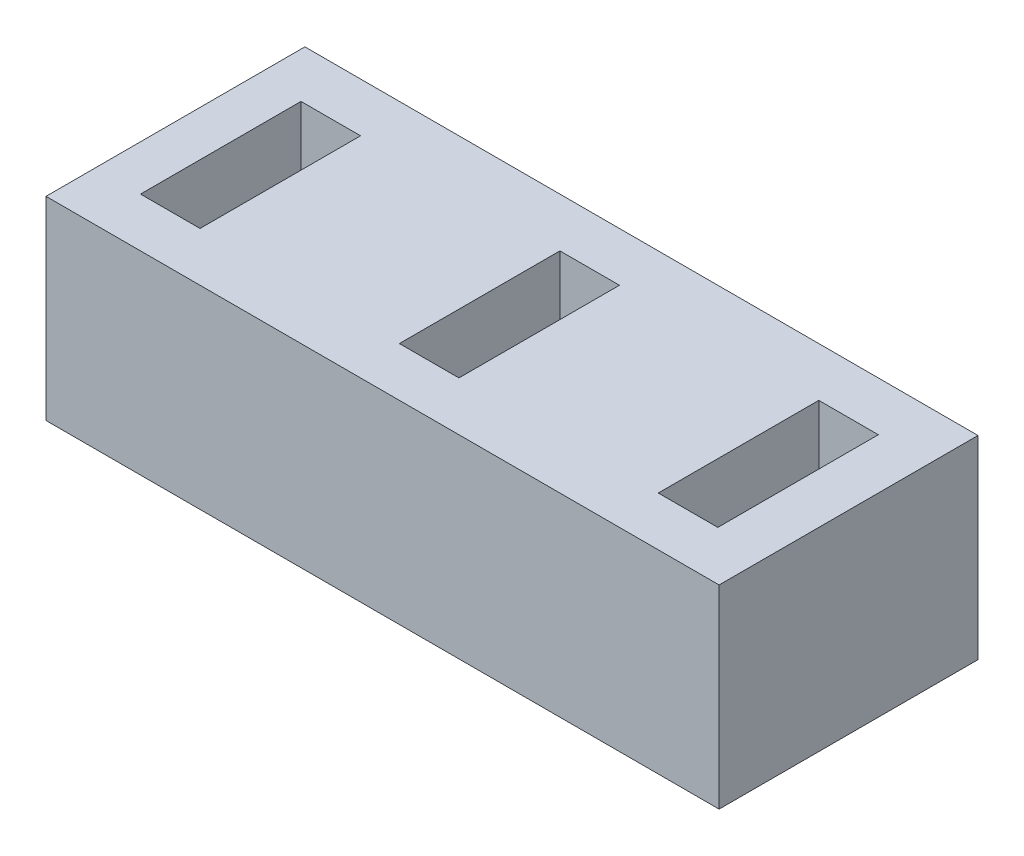
ISO-10303-21;
HEADER;
FILE_DESCRIPTION(('STEP AP214'),'2;1');
FILE_NAME('part.step','',(''),(''),'','','');
FILE_SCHEMA(('AUTOMOTIVE_DESIGN { 1 0 10303 214 1 1 1 1 }'));
ENDSEC;
DATA;
#1=APPLICATION_CONTEXT('core data for automotive mechanical design processes');
#2=APPLICATION_PROTOCOL_DEFINITION('international standard','automotive_design',2000,#1);
#3=PRODUCT_CONTEXT('',#1,'mechanical');
#4=PRODUCT('Part','Part','',(#3));
#5=PRODUCT_RELATED_PRODUCT_CATEGORY('part','',(#4));
#6=PRODUCT_DEFINITION_FORMATION('','',#4);
#7=PRODUCT_DEFINITION_CONTEXT('part definition',#1,'design');
#8=PRODUCT_DEFINITION('design','',#6,#7);
#9=PRODUCT_DEFINITION_SHAPE('','',#8);
#10=(LENGTH_UNIT() NAMED_UNIT(*) SI_UNIT(.MILLI.,.METRE.));
#11=(NAMED_UNIT(*) PLANE_ANGLE_UNIT() SI_UNIT($,.RADIAN.));
#12=(NAMED_UNIT(*) SI_UNIT($,.STERADIAN.) SOLID_ANGLE_UNIT());
#13=UNCERTAINTY_MEASURE_WITH_UNIT(LENGTH_MEASURE(1.E-05),#10,'distance_accuracy_value','');
#14=(GEOMETRIC_REPRESENTATION_CONTEXT(3) GLOBAL_UNCERTAINTY_ASSIGNED_CONTEXT((#13)) GLOBAL_UNIT_ASSIGNED_CONTEXT((#10,
#11,#12)) REPRESENTATION_CONTEXT('',''));
#15=CARTESIAN_POINT('',(0.,0.,0.));
#16=DIRECTION('',(0.,0.,1.));
#17=DIRECTION('',(1.,0.,0.));
#18=AXIS2_PLACEMENT_3D('',#15,#16,#17);
#19=CARTESIAN_POINT('',(52.,15.,-20.));
#20=DIRECTION('',(1.,0.,0.));
#21=DIRECTION('',(0.,0.,-1.));
#22=AXIS2_PLACEMENT_3D('',#19,#20,#21);
#23=PLANE('',#22);
#24=DIRECTION('',(0.,0.,1.));
#25=VECTOR('',#24,1.);
#26=CARTESIAN_POINT('',(52.,0.,-20.));
#27=LINE('',#26,#25);
#28=CARTESIAN_POINT('',(52.,0.,-20.));
#29=VERTEX_POINT('',#28);
#30=CARTESIAN_POINT('',(52.,0.,0.));
#31=VERTEX_POINT('',#30);
#32=EDGE_CURVE('E203',#29,#31,#27,.T.);
#33=ORIENTED_EDGE('',*,*,#32,.F.);
#34=DIRECTION('',(0.,-1.,0.));
#35=VECTOR('',#34,1.);
#36=CARTESIAN_POINT('',(52.,15.,-20.));
#37=LINE('',#36,#35);
#38=CARTESIAN_POINT('',(52.,15.,-20.));
#39=VERTEX_POINT('',#38);
#40=EDGE_CURVE('E11',#39,#29,#37,.T.);
#41=ORIENTED_EDGE('',*,*,#40,.F.);
#42=DIRECTION('',(0.,0.,1.));
#43=VECTOR('',#42,1.);
#44=CARTESIAN_POINT('',(52.,15.,-20.));
#45=LINE('',#44,#43);
#46=CARTESIAN_POINT('',(52.,15.,0.));
#47=VERTEX_POINT('',#46);
#48=EDGE_CURVE('E295',#39,#47,#45,.T.);
#49=ORIENTED_EDGE('',*,*,#48,.T.);
#50=DIRECTION('',(0.,-1.,0.));
#51=VECTOR('',#50,1.);
#52=CARTESIAN_POINT('',(52.,15.,0.));
#53=LINE('',#52,#51);
#54=EDGE_CURVE('E46',#47,#31,#53,.T.);
#55=ORIENTED_EDGE('',*,*,#54,.T.);
#56=EDGE_LOOP('',(#33,#41,#49,#55));
#57=FACE_BOUND('',#56,.T.);
#58=ADVANCED_FACE('F43',(#57),#23,.T.);
#59=CARTESIAN_POINT('',(0.,15.,-20.));
#60=DIRECTION('',(0.,0.,-1.));
#61=DIRECTION('',(-1.,0.,0.));
#62=AXIS2_PLACEMENT_3D('',#59,#60,#61);
#63=PLANE('',#62);
#64=DIRECTION('',(1.,0.,0.));
#65=VECTOR('',#64,1.);
#66=CARTESIAN_POINT('',(0.,0.,-20.));
#67=LINE('',#66,#65);
#68=CARTESIAN_POINT('',(0.,0.,-20.));
#69=VERTEX_POINT('',#68);
#70=EDGE_CURVE('E300',#69,#29,#67,.T.);
#71=ORIENTED_EDGE('',*,*,#70,.F.);
#72=DIRECTION('',(0.,-1.,0.));
#73=VECTOR('',#72,1.);
#74=CARTESIAN_POINT('',(0.,15.,-20.));
#75=LINE('',#74,#73);
#76=CARTESIAN_POINT('',(0.,15.,-20.));
#77=VERTEX_POINT('',#76);
#78=EDGE_CURVE('E52',#77,#69,#75,.T.);
#79=ORIENTED_EDGE('',*,*,#78,.F.);
#80=DIRECTION('',(1.,0.,0.));
#81=VECTOR('',#80,1.);
#82=CARTESIAN_POINT('',(0.,15.,-20.));
#83=LINE('',#82,#81);
#84=EDGE_CURVE('E308',#77,#39,#83,.T.);
#85=ORIENTED_EDGE('',*,*,#84,.T.);
#86=ORIENTED_EDGE('',*,*,#40,.T.);
#87=EDGE_LOOP('',(#71,#79,#85,#86));
#88=FACE_BOUND('',#87,.T.);
#89=ADVANCED_FACE('F341',(#88),#63,.T.);
#90=CARTESIAN_POINT('',(0.,15.,0.));
#91=DIRECTION('',(-1.,0.,0.));
#92=DIRECTION('',(0.,0.,1.));
#93=AXIS2_PLACEMENT_3D('',#90,#91,#92);
#94=PLANE('',#93);
#95=DIRECTION('',(0.,0.,-1.));
#96=VECTOR('',#95,1.);
#97=CARTESIAN_POINT('',(0.,0.,0.));
#98=LINE('',#97,#96);
#99=CARTESIAN_POINT('',(0.,0.,0.));
#100=VERTEX_POINT('',#99);
#101=EDGE_CURVE('E319',#100,#69,#98,.T.);
#102=ORIENTED_EDGE('',*,*,#101,.F.);
#103=DIRECTION('',(0.,-1.,0.));
#104=VECTOR('',#103,1.);
#105=CARTESIAN_POINT('',(0.,15.,0.));
#106=LINE('',#105,#104);
#107=CARTESIAN_POINT('',(0.,15.,0.));
#108=VERTEX_POINT('',#107);
#109=EDGE_CURVE('E327',#108,#100,#106,.T.);
#110=ORIENTED_EDGE('',*,*,#109,.F.);
#111=DIRECTION('',(0.,0.,-1.));
#112=VECTOR('',#111,1.);
#113=CARTESIAN_POINT('',(0.,15.,0.));
#114=LINE('',#113,#112);
#115=EDGE_CURVE('E304',#108,#77,#114,.T.);
#116=ORIENTED_EDGE('',*,*,#115,.T.);
#117=ORIENTED_EDGE('',*,*,#78,.T.);
#118=EDGE_LOOP('',(#102,#110,#116,#117));
#119=FACE_BOUND('',#118,.T.);
#120=ADVANCED_FACE('F347',(#119),#94,.T.);
#121=CARTESIAN_POINT('',(52.,15.,0.));
#122=DIRECTION('',(0.,0.,1.));
#123=DIRECTION('',(1.,0.,0.));
#124=AXIS2_PLACEMENT_3D('',#121,#122,#123);
#125=PLANE('',#124);
#126=DIRECTION('',(-1.,0.,0.));
#127=VECTOR('',#126,1.);
#128=CARTESIAN_POINT('',(52.,0.,0.));
#129=LINE('',#128,#127);
#130=EDGE_CURVE('E315',#31,#100,#129,.T.);
#131=ORIENTED_EDGE('',*,*,#130,.F.);
#132=ORIENTED_EDGE('',*,*,#54,.F.);
#133=DIRECTION('',(-1.,0.,0.));
#134=VECTOR('',#133,1.);
#135=CARTESIAN_POINT('',(52.,15.,0.));
#136=LINE('',#135,#134);
#137=EDGE_CURVE('E299',#47,#108,#136,.T.);
#138=ORIENTED_EDGE('',*,*,#137,.T.);
#139=ORIENTED_EDGE('',*,*,#109,.T.);
#140=EDGE_LOOP('',(#131,#132,#138,#139));
#141=FACE_BOUND('',#140,.T.);
#142=ADVANCED_FACE('F337',(#141),#125,.T.);
#143=CARTESIAN_POINT('',(0.,15.,0.));
#144=DIRECTION('',(0.,-1.,0.));
#145=DIRECTION('',(0.,0.,-1.));
#146=AXIS2_PLACEMENT_3D('',#143,#144,#145);
#147=PLANE('',#146);
#148=DIRECTION('',(1.,0.,0.));
#149=VECTOR('',#148,1.);
#150=CARTESIAN_POINT('',(8.1,15.,-3.8));
#151=LINE('',#150,#149);
#152=CARTESIAN_POINT('',(3.5,15.,-3.8));
#153=VERTEX_POINT('',#152);
#154=CARTESIAN_POINT('',(8.1,15.,-3.8));
#155=VERTEX_POINT('',#154);
#156=EDGE_CURVE('E194',#153,#155,#151,.T.);
#157=ORIENTED_EDGE('',*,*,#156,.F.);
#158=DIRECTION('',(0.,0.,1.));
#159=VECTOR('',#158,1.);
#160=CARTESIAN_POINT('',(3.5,15.,-3.8));
#161=LINE('',#160,#159);
#162=CARTESIAN_POINT('',(3.5,15.,-16.2));
#163=VERTEX_POINT('',#162);
#164=EDGE_CURVE('E60',#163,#153,#161,.T.);
#165=ORIENTED_EDGE('',*,*,#164,.F.);
#166=DIRECTION('',(-1.,0.,0.));
#167=VECTOR('',#166,1.);
#168=CARTESIAN_POINT('',(3.5,15.,-16.2));
#169=LINE('',#168,#167);
#170=CARTESIAN_POINT('',(8.1,15.,-16.2));
#171=VERTEX_POINT('',#170);
#172=EDGE_CURVE('E181',#171,#163,#169,.T.);
#173=ORIENTED_EDGE('',*,*,#172,.F.);
#174=DIRECTION('',(0.,0.,-1.));
#175=VECTOR('',#174,1.);
#176=CARTESIAN_POINT('',(8.1,15.,-16.2));
#177=LINE('',#176,#175);
#178=EDGE_CURVE('E185',#155,#171,#177,.T.);
#179=ORIENTED_EDGE('',*,*,#178,.F.);
#180=EDGE_LOOP('',(#157,#165,#173,#179));
#181=FACE_BOUND('',#180,.T.);
#182=DIRECTION('',(1.,0.,0.));
#183=VECTOR('',#182,1.);
#184=CARTESIAN_POINT('',(48.1,15.,-3.8));
#185=LINE('',#184,#183);
#186=CARTESIAN_POINT('',(43.5,15.,-3.8));
#187=VERTEX_POINT('',#186);
#188=CARTESIAN_POINT('',(48.1,15.,-3.8));
#189=VERTEX_POINT('',#188);
#190=EDGE_CURVE('E232',#187,#189,#185,.T.);
#191=ORIENTED_EDGE('',*,*,#190,.F.);
#192=DIRECTION('',(0.,0.,1.));
#193=VECTOR('',#192,1.);
#194=CARTESIAN_POINT('',(43.5,15.,-3.8));
#195=LINE('',#194,#193);
#196=CARTESIAN_POINT('',(43.5,15.,-16.2));
#197=VERTEX_POINT('',#196);
#198=EDGE_CURVE('E68',#197,#187,#195,.T.);
#199=ORIENTED_EDGE('',*,*,#198,.F.);
#200=DIRECTION('',(-1.,0.,0.));
#201=VECTOR('',#200,1.);
#202=CARTESIAN_POINT('',(43.5,15.,-16.2));
#203=LINE('',#202,#201);
#204=CARTESIAN_POINT('',(48.1,15.,-16.2));
#205=VERTEX_POINT('',#204);
#206=EDGE_CURVE('E223',#205,#197,#203,.T.);
#207=ORIENTED_EDGE('',*,*,#206,.F.);
#208=DIRECTION('',(0.,0.,-1.));
#209=VECTOR('',#208,1.);
#210=CARTESIAN_POINT('',(48.1,15.,-16.2));
#211=LINE('',#210,#209);
#212=EDGE_CURVE('E227',#189,#205,#211,.T.);
#213=ORIENTED_EDGE('',*,*,#212,.F.);
#214=EDGE_LOOP('',(#191,#199,#207,#213));
#215=FACE_BOUND('',#214,.T.);
#216=DIRECTION('',(1.,0.,0.));
#217=VECTOR('',#216,1.);
#218=CARTESIAN_POINT('',(28.1,15.,-3.8));
#219=LINE('',#218,#217);
#220=CARTESIAN_POINT('',(23.5,15.,-3.8));
#221=VERTEX_POINT('',#220);
#222=CARTESIAN_POINT('',(28.1,15.,-3.8));
#223=VERTEX_POINT('',#222);
#224=EDGE_CURVE('E275',#221,#223,#219,.T.);
#225=ORIENTED_EDGE('',*,*,#224,.F.);
#226=DIRECTION('',(0.,0.,1.));
#227=VECTOR('',#226,1.);
#228=CARTESIAN_POINT('',(23.5,15.,-3.8));
#229=LINE('',#228,#227);
#230=CARTESIAN_POINT('',(23.5,15.,-16.2));
#231=VERTEX_POINT('',#230);
#232=EDGE_CURVE('E222',#231,#221,#229,.T.);
#233=ORIENTED_EDGE('',*,*,#232,.F.);
#234=DIRECTION('',(-1.,0.,0.));
#235=VECTOR('',#234,1.);
#236=CARTESIAN_POINT('',(23.5,15.,-16.2));
#237=LINE('',#236,#235);
#238=CARTESIAN_POINT('',(28.1,15.,-16.2));
#239=VERTEX_POINT('',#238);
#240=EDGE_CURVE('E266',#239,#231,#237,.T.);
#241=ORIENTED_EDGE('',*,*,#240,.F.);
#242=DIRECTION('',(0.,0.,-1.));
#243=VECTOR('',#242,1.);
#244=CARTESIAN_POINT('',(28.1,15.,-16.2));
#245=LINE('',#244,#243);
#246=EDGE_CURVE('E270',#223,#239,#245,.T.);
#247=ORIENTED_EDGE('',*,*,#246,.F.);
#248=EDGE_LOOP('',(#225,#233,#241,#247));
#249=FACE_BOUND('',#248,.T.);
#250=ORIENTED_EDGE('',*,*,#48,.F.);
#251=ORIENTED_EDGE('',*,*,#84,.F.);
#252=ORIENTED_EDGE('',*,*,#115,.F.);
#253=ORIENTED_EDGE('',*,*,#137,.F.);
#254=EDGE_LOOP('',(#250,#251,#252,#253));
#255=FACE_BOUND('',#254,.T.);
#256=ADVANCED_FACE('F344',(#181,#215,#249,#255),#147,.F.);
#257=CARTESIAN_POINT('',(0.,0.,0.));
#258=DIRECTION('',(0.,-1.,0.));
#259=DIRECTION('',(0.,0.,-1.));
#260=AXIS2_PLACEMENT_3D('',#257,#258,#259);
#261=PLANE('',#260);
#262=DIRECTION('',(0.,0.,1.));
#263=VECTOR('',#262,1.);
#264=CARTESIAN_POINT('',(3.5,0.,-3.8));
#265=LINE('',#264,#263);
#266=CARTESIAN_POINT('',(3.5,0.,-16.2));
#267=VERTEX_POINT('',#266);
#268=CARTESIAN_POINT('',(3.5,0.,-3.8));
#269=VERTEX_POINT('',#268);
#270=EDGE_CURVE('E159',#267,#269,#265,.T.);
#271=ORIENTED_EDGE('',*,*,#270,.T.);
#272=DIRECTION('',(1.,0.,0.));
#273=VECTOR('',#272,1.);
#274=CARTESIAN_POINT('',(8.1,0.,-3.8));
#275=LINE('',#274,#273);
#276=CARTESIAN_POINT('',(8.1,0.,-3.8));
#277=VERTEX_POINT('',#276);
#278=EDGE_CURVE('E170',#269,#277,#275,.T.);
#279=ORIENTED_EDGE('',*,*,#278,.T.);
#280=DIRECTION('',(0.,0.,-1.));
#281=VECTOR('',#280,1.);
#282=CARTESIAN_POINT('',(8.1,0.,-16.2));
#283=LINE('',#282,#281);
#284=CARTESIAN_POINT('',(8.1,0.,-16.2));
#285=VERTEX_POINT('',#284);
#286=EDGE_CURVE('E175',#277,#285,#283,.T.);
#287=ORIENTED_EDGE('',*,*,#286,.T.);
#288=DIRECTION('',(-1.,0.,0.));
#289=VECTOR('',#288,1.);
#290=CARTESIAN_POINT('',(3.5,0.,-16.2));
#291=LINE('',#290,#289);
#292=EDGE_CURVE('E166',#285,#267,#291,.T.);
#293=ORIENTED_EDGE('',*,*,#292,.T.);
#294=EDGE_LOOP('',(#271,#279,#287,#293));
#295=FACE_BOUND('',#294,.T.);
#296=DIRECTION('',(0.,0.,1.));
#297=VECTOR('',#296,1.);
#298=CARTESIAN_POINT('',(43.5,0.,-3.8));
#299=LINE('',#298,#297);
#300=CARTESIAN_POINT('',(43.5,0.,-16.2));
#301=VERTEX_POINT('',#300);
#302=CARTESIAN_POINT('',(43.5,0.,-3.8));
#303=VERTEX_POINT('',#302);
#304=EDGE_CURVE('E228',#301,#303,#299,.T.);
#305=ORIENTED_EDGE('',*,*,#304,.T.);
#306=DIRECTION('',(1.,0.,0.));
#307=VECTOR('',#306,1.);
#308=CARTESIAN_POINT('',(48.1,0.,-3.8));
#309=LINE('',#308,#307);
#310=CARTESIAN_POINT('',(48.1,0.,-3.8));
#311=VERTEX_POINT('',#310);
#312=EDGE_CURVE('E245',#303,#311,#309,.T.);
#313=ORIENTED_EDGE('',*,*,#312,.T.);
#314=DIRECTION('',(0.,0.,-1.));
#315=VECTOR('',#314,1.);
#316=CARTESIAN_POINT('',(48.1,0.,-16.2));
#317=LINE('',#316,#315);
#318=CARTESIAN_POINT('',(48.1,0.,-16.2));
#319=VERTEX_POINT('',#318);
#320=EDGE_CURVE('E241',#311,#319,#317,.T.);
#321=ORIENTED_EDGE('',*,*,#320,.T.);
#322=DIRECTION('',(-1.,0.,0.));
#323=VECTOR('',#322,1.);
#324=CARTESIAN_POINT('',(43.5,0.,-16.2));
#325=LINE('',#324,#323);
#326=EDGE_CURVE('E212',#319,#301,#325,.T.);
#327=ORIENTED_EDGE('',*,*,#326,.T.);
#328=EDGE_LOOP('',(#305,#313,#321,#327));
#329=FACE_BOUND('',#328,.T.);
#330=DIRECTION('',(0.,0.,1.));
#331=VECTOR('',#330,1.);
#332=CARTESIAN_POINT('',(23.5,0.,-3.8));
#333=LINE('',#332,#331);
#334=CARTESIAN_POINT('',(23.5,0.,-16.2));
#335=VERTEX_POINT('',#334);
#336=CARTESIAN_POINT('',(23.5,0.,-3.8));
#337=VERTEX_POINT('',#336);
#338=EDGE_CURVE('E271',#335,#337,#333,.T.);
#339=ORIENTED_EDGE('',*,*,#338,.T.);
#340=DIRECTION('',(1.,0.,0.));
#341=VECTOR('',#340,1.);
#342=CARTESIAN_POINT('',(28.1,0.,-3.8));
#343=LINE('',#342,#341);
#344=CARTESIAN_POINT('',(28.1,0.,-3.8));
#345=VERTEX_POINT('',#344);
#346=EDGE_CURVE('E288',#337,#345,#343,.T.);
#347=ORIENTED_EDGE('',*,*,#346,.T.);
#348=DIRECTION('',(0.,0.,-1.));
#349=VECTOR('',#348,1.);
#350=CARTESIAN_POINT('',(28.1,0.,-16.2));
#351=LINE('',#350,#349);
#352=CARTESIAN_POINT('',(28.1,0.,-16.2));
#353=VERTEX_POINT('',#352);
#354=EDGE_CURVE('E284',#345,#353,#351,.T.);
#355=ORIENTED_EDGE('',*,*,#354,.T.);
#356=DIRECTION('',(-1.,0.,0.));
#357=VECTOR('',#356,1.);
#358=CARTESIAN_POINT('',(23.5,0.,-16.2));
#359=LINE('',#358,#357);
#360=EDGE_CURVE('E256',#353,#335,#359,.T.);
#361=ORIENTED_EDGE('',*,*,#360,.T.);
#362=EDGE_LOOP('',(#339,#347,#355,#361));
#363=FACE_BOUND('',#362,.T.);
#364=ORIENTED_EDGE('',*,*,#32,.T.);
#365=ORIENTED_EDGE('',*,*,#130,.T.);
#366=ORIENTED_EDGE('',*,*,#101,.T.);
#367=ORIENTED_EDGE('',*,*,#70,.T.);
#368=EDGE_LOOP('',(#364,#365,#366,#367));
#369=FACE_BOUND('',#368,.T.);
#370=ADVANCED_FACE('F177',(#295,#329,#363,#369),#261,.T.);
#371=CARTESIAN_POINT('',(23.5,0.,-3.8));
#372=DIRECTION('',(-1.,0.,0.));
#373=DIRECTION('',(0.,0.,1.));
#374=AXIS2_PLACEMENT_3D('',#371,#372,#373);
#375=PLANE('',#374);
#376=ORIENTED_EDGE('',*,*,#232,.T.);
#377=DIRECTION('',(0.,1.,0.));
#378=VECTOR('',#377,1.);
#379=CARTESIAN_POINT('',(23.5,0.,-3.8));
#380=LINE('',#379,#378);
#381=EDGE_CURVE('E252',#337,#221,#380,.T.);
#382=ORIENTED_EDGE('',*,*,#381,.F.);
#383=ORIENTED_EDGE('',*,*,#338,.F.);
#384=DIRECTION('',(0.,1.,0.));
#385=VECTOR('',#384,1.);
#386=CARTESIAN_POINT('',(23.5,0.,-16.2));
#387=LINE('',#386,#385);
#388=EDGE_CURVE('E263',#335,#231,#387,.T.);
#389=ORIENTED_EDGE('',*,*,#388,.T.);
#390=EDGE_LOOP('',(#376,#382,#383,#389));
#391=FACE_BOUND('',#390,.T.);
#392=ADVANCED_FACE('F394',(#391),#375,.F.);
#393=CARTESIAN_POINT('',(23.5,0.,-16.2));
#394=DIRECTION('',(0.,0.,-1.));
#395=DIRECTION('',(-1.,0.,0.));
#396=AXIS2_PLACEMENT_3D('',#393,#394,#395);
#397=PLANE('',#396);
#398=ORIENTED_EDGE('',*,*,#240,.T.);
#399=ORIENTED_EDGE('',*,*,#388,.F.);
#400=ORIENTED_EDGE('',*,*,#360,.F.);
#401=DIRECTION('',(0.,1.,0.));
#402=VECTOR('',#401,1.);
#403=CARTESIAN_POINT('',(28.1,0.,-16.2));
#404=LINE('',#403,#402);
#405=EDGE_CURVE('E260',#353,#239,#404,.T.);
#406=ORIENTED_EDGE('',*,*,#405,.T.);
#407=EDGE_LOOP('',(#398,#399,#400,#406));
#408=FACE_BOUND('',#407,.T.);
#409=ADVANCED_FACE('F404',(#408),#397,.F.);
#410=CARTESIAN_POINT('',(28.1,0.,-16.2));
#411=DIRECTION('',(1.,0.,0.));
#412=DIRECTION('',(0.,0.,-1.));
#413=AXIS2_PLACEMENT_3D('',#410,#411,#412);
#414=PLANE('',#413);
#415=ORIENTED_EDGE('',*,*,#246,.T.);
#416=ORIENTED_EDGE('',*,*,#405,.F.);
#417=ORIENTED_EDGE('',*,*,#354,.F.);
#418=DIRECTION('',(0.,1.,0.));
#419=VECTOR('',#418,1.);
#420=CARTESIAN_POINT('',(28.1,0.,-3.8));
#421=LINE('',#420,#419);
#422=EDGE_CURVE('E257',#345,#223,#421,.T.);
#423=ORIENTED_EDGE('',*,*,#422,.T.);
#424=EDGE_LOOP('',(#415,#416,#417,#423));
#425=FACE_BOUND('',#424,.T.);
#426=ADVANCED_FACE('F415',(#425),#414,.F.);
#427=CARTESIAN_POINT('',(28.1,0.,-3.8));
#428=DIRECTION('',(0.,0.,1.));
#429=DIRECTION('',(1.,0.,0.));
#430=AXIS2_PLACEMENT_3D('',#427,#428,#429);
#431=PLANE('',#430);
#432=ORIENTED_EDGE('',*,*,#224,.T.);
#433=ORIENTED_EDGE('',*,*,#422,.F.);
#434=ORIENTED_EDGE('',*,*,#346,.F.);
#435=ORIENTED_EDGE('',*,*,#381,.T.);
#436=EDGE_LOOP('',(#432,#433,#434,#435));
#437=FACE_BOUND('',#436,.T.);
#438=ADVANCED_FACE('F426',(#437),#431,.F.);
#439=CARTESIAN_POINT('',(43.5,0.,-3.8));
#440=DIRECTION('',(-1.,0.,0.));
#441=DIRECTION('',(0.,0.,1.));
#442=AXIS2_PLACEMENT_3D('',#439,#440,#441);
#443=PLANE('',#442);
#444=ORIENTED_EDGE('',*,*,#198,.T.);
#445=DIRECTION('',(0.,1.,0.));
#446=VECTOR('',#445,1.);
#447=CARTESIAN_POINT('',(43.5,0.,-3.8));
#448=LINE('',#447,#446);
#449=EDGE_CURVE('E209',#303,#187,#448,.T.);
#450=ORIENTED_EDGE('',*,*,#449,.F.);
#451=ORIENTED_EDGE('',*,*,#304,.F.);
#452=DIRECTION('',(0.,1.,0.));
#453=VECTOR('',#452,1.);
#454=CARTESIAN_POINT('',(43.5,0.,-16.2));
#455=LINE('',#454,#453);
#456=EDGE_CURVE('E219',#301,#197,#455,.T.);
#457=ORIENTED_EDGE('',*,*,#456,.T.);
#458=EDGE_LOOP('',(#444,#450,#451,#457));
#459=FACE_BOUND('',#458,.T.);
#460=ADVANCED_FACE('F437',(#459),#443,.F.);
#461=CARTESIAN_POINT('',(43.5,0.,-16.2));
#462=DIRECTION('',(0.,0.,-1.));
#463=DIRECTION('',(-1.,0.,0.));
#464=AXIS2_PLACEMENT_3D('',#461,#462,#463);
#465=PLANE('',#464);
#466=ORIENTED_EDGE('',*,*,#206,.T.);
#467=ORIENTED_EDGE('',*,*,#456,.F.);
#468=ORIENTED_EDGE('',*,*,#326,.F.);
#469=DIRECTION('',(0.,1.,0.));
#470=VECTOR('',#469,1.);
#471=CARTESIAN_POINT('',(48.1,0.,-16.2));
#472=LINE('',#471,#470);
#473=EDGE_CURVE('E216',#319,#205,#472,.T.);
#474=ORIENTED_EDGE('',*,*,#473,.T.);
#475=EDGE_LOOP('',(#466,#467,#468,#474));
#476=FACE_BOUND('',#475,.T.);
#477=ADVANCED_FACE('F448',(#476),#465,.F.);
#478=CARTESIAN_POINT('',(48.1,0.,-16.2));
#479=DIRECTION('',(1.,0.,0.));
#480=DIRECTION('',(0.,0.,-1.));
#481=AXIS2_PLACEMENT_3D('',#478,#479,#480);
#482=PLANE('',#481);
#483=ORIENTED_EDGE('',*,*,#212,.T.);
#484=ORIENTED_EDGE('',*,*,#473,.F.);
#485=ORIENTED_EDGE('',*,*,#320,.F.);
#486=DIRECTION('',(0.,1.,0.));
#487=VECTOR('',#486,1.);
#488=CARTESIAN_POINT('',(48.1,0.,-3.8));
#489=LINE('',#488,#487);
#490=EDGE_CURVE('E213',#311,#189,#489,.T.);
#491=ORIENTED_EDGE('',*,*,#490,.T.);
#492=EDGE_LOOP('',(#483,#484,#485,#491));
#493=FACE_BOUND('',#492,.T.);
#494=ADVANCED_FACE('F458',(#493),#482,.F.);
#495=CARTESIAN_POINT('',(48.1,0.,-3.8));
#496=DIRECTION('',(0.,0.,1.));
#497=DIRECTION('',(1.,0.,0.));
#498=AXIS2_PLACEMENT_3D('',#495,#496,#497);
#499=PLANE('',#498);
#500=ORIENTED_EDGE('',*,*,#190,.T.);
#501=ORIENTED_EDGE('',*,*,#490,.F.);
#502=ORIENTED_EDGE('',*,*,#312,.F.);
#503=ORIENTED_EDGE('',*,*,#449,.T.);
#504=EDGE_LOOP('',(#500,#501,#502,#503));
#505=FACE_BOUND('',#504,.T.);
#506=ADVANCED_FACE('F469',(#505),#499,.F.);
#507=CARTESIAN_POINT('',(3.5,0.,-3.8));
#508=DIRECTION('',(-1.,0.,0.));
#509=DIRECTION('',(0.,0.,1.));
#510=AXIS2_PLACEMENT_3D('',#507,#508,#509);
#511=PLANE('',#510);
#512=ORIENTED_EDGE('',*,*,#164,.T.);
#513=DIRECTION('',(0.,1.,0.));
#514=VECTOR('',#513,1.);
#515=CARTESIAN_POINT('',(3.5,0.,-3.8));
#516=LINE('',#515,#514);
#517=EDGE_CURVE('E155',#269,#153,#516,.T.);
#518=ORIENTED_EDGE('',*,*,#517,.F.);
#519=ORIENTED_EDGE('',*,*,#270,.F.);
#520=DIRECTION('',(0.,1.,0.));
#521=VECTOR('',#520,1.);
#522=CARTESIAN_POINT('',(3.5,0.,-16.2));
#523=LINE('',#522,#521);
#524=EDGE_CURVE('E200',#267,#163,#523,.T.);
#525=ORIENTED_EDGE('',*,*,#524,.T.);
#526=EDGE_LOOP('',(#512,#518,#519,#525));
#527=FACE_BOUND('',#526,.T.);
#528=ADVANCED_FACE('F157',(#527),#511,.F.);
#529=CARTESIAN_POINT('',(3.5,0.,-16.2));
#530=DIRECTION('',(0.,0.,-1.));
#531=DIRECTION('',(-1.,0.,0.));
#532=AXIS2_PLACEMENT_3D('',#529,#530,#531);
#533=PLANE('',#532);
#534=ORIENTED_EDGE('',*,*,#172,.T.);
#535=ORIENTED_EDGE('',*,*,#524,.F.);
#536=ORIENTED_EDGE('',*,*,#292,.F.);
#537=DIRECTION('',(0.,1.,0.));
#538=VECTOR('',#537,1.);
#539=CARTESIAN_POINT('',(8.1,0.,-16.2));
#540=LINE('',#539,#538);
#541=EDGE_CURVE('E204',#285,#171,#540,.T.);
#542=ORIENTED_EDGE('',*,*,#541,.T.);
#543=EDGE_LOOP('',(#534,#535,#536,#542));
#544=FACE_BOUND('',#543,.T.);
#545=ADVANCED_FACE('F490',(#544),#533,.F.);
#546=CARTESIAN_POINT('',(8.1,0.,-16.2));
#547=DIRECTION('',(1.,0.,0.));
#548=DIRECTION('',(0.,0.,-1.));
#549=AXIS2_PLACEMENT_3D('',#546,#547,#548);
#550=PLANE('',#549);
#551=ORIENTED_EDGE('',*,*,#178,.T.);
#552=ORIENTED_EDGE('',*,*,#541,.F.);
#553=ORIENTED_EDGE('',*,*,#286,.F.);
#554=DIRECTION('',(0.,1.,0.));
#555=VECTOR('',#554,1.);
#556=CARTESIAN_POINT('',(8.1,0.,-3.8));
#557=LINE('',#556,#555);
#558=EDGE_CURVE('E165',#277,#155,#557,.T.);
#559=ORIENTED_EDGE('',*,*,#558,.T.);
#560=EDGE_LOOP('',(#551,#552,#553,#559));
#561=FACE_BOUND('',#560,.T.);
#562=ADVANCED_FACE('F500',(#561),#550,.F.);
#563=CARTESIAN_POINT('',(8.1,0.,-3.8));
#564=DIRECTION('',(0.,0.,1.));
#565=DIRECTION('',(1.,0.,0.));
#566=AXIS2_PLACEMENT_3D('',#563,#564,#565);
#567=PLANE('',#566);
#568=ORIENTED_EDGE('',*,*,#156,.T.);
#569=ORIENTED_EDGE('',*,*,#558,.F.);
#570=ORIENTED_EDGE('',*,*,#278,.F.);
#571=ORIENTED_EDGE('',*,*,#517,.T.);
#572=EDGE_LOOP('',(#568,#569,#570,#571));
#573=FACE_BOUND('',#572,.T.);
#574=ADVANCED_FACE('F171',(#573),#567,.F.);
#575=CLOSED_SHELL('',(#58,#89,#120,#142,#256,#370,#392,#409,#426,#438,#460,#477,#494,#506,#528,
#545,#562,#574));
#576=MANIFOLD_SOLID_BREP('B2',#575);
#577=ADVANCED_BREP_SHAPE_REPRESENTATION('',(#18,#576),#14);
#578=SHAPE_DEFINITION_REPRESENTATION(#9,#577);
ENDSEC;
END-ISO-10303-21;
